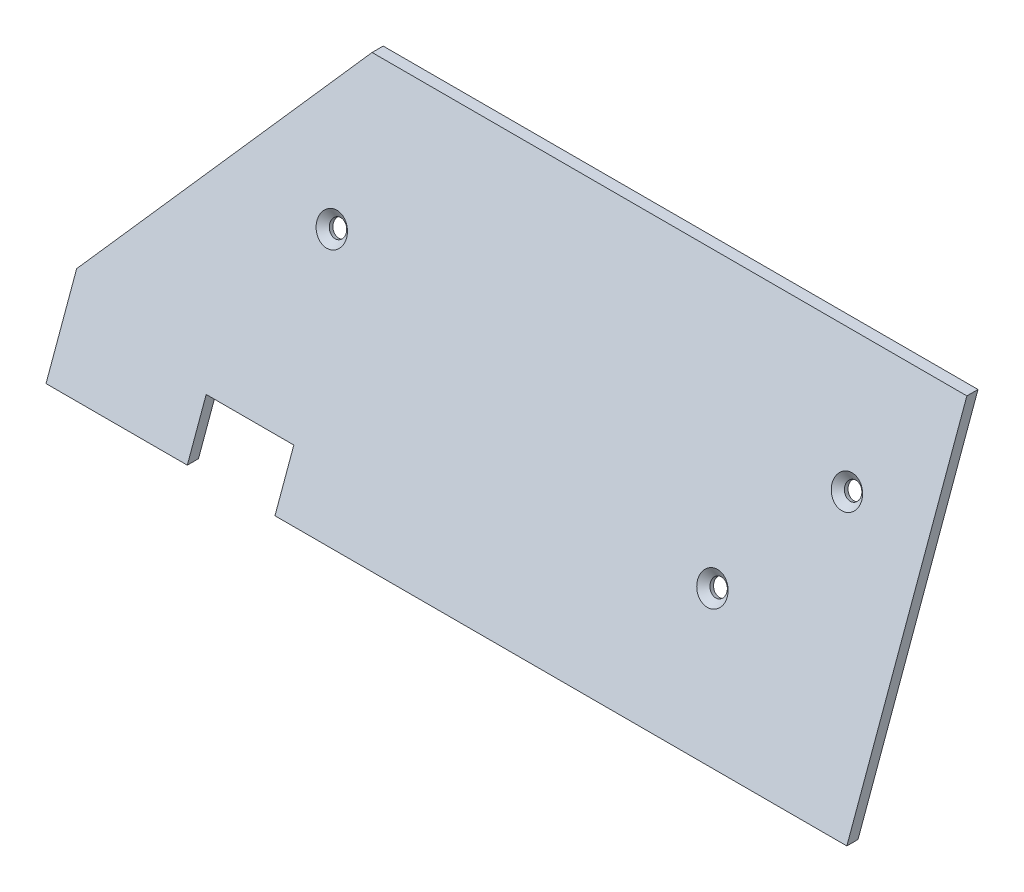
ISO-10303-21;
HEADER;
FILE_DESCRIPTION(('STEP AP214'),'2;1');
FILE_NAME('part.step','',(''),(''),'','','');
FILE_SCHEMA(('AUTOMOTIVE_DESIGN { 1 0 10303 214 1 1 1 1 }'));
ENDSEC;
DATA;
#1=APPLICATION_CONTEXT('core data for automotive mechanical design processes');
#2=APPLICATION_PROTOCOL_DEFINITION('international standard','automotive_design',2000,#1);
#3=PRODUCT_CONTEXT('',#1,'mechanical');
#4=PRODUCT('Part','Part','',(#3));
#5=PRODUCT_RELATED_PRODUCT_CATEGORY('part','',(#4));
#6=PRODUCT_DEFINITION_FORMATION('','',#4);
#7=PRODUCT_DEFINITION_CONTEXT('part definition',#1,'design');
#8=PRODUCT_DEFINITION('design','',#6,#7);
#9=PRODUCT_DEFINITION_SHAPE('','',#8);
#10=(LENGTH_UNIT() NAMED_UNIT(*) SI_UNIT(.MILLI.,.METRE.));
#11=(NAMED_UNIT(*) PLANE_ANGLE_UNIT() SI_UNIT($,.RADIAN.));
#12=(NAMED_UNIT(*) SI_UNIT($,.STERADIAN.) SOLID_ANGLE_UNIT());
#13=UNCERTAINTY_MEASURE_WITH_UNIT(LENGTH_MEASURE(1.E-05),#10,'distance_accuracy_value','');
#14=(GEOMETRIC_REPRESENTATION_CONTEXT(3) GLOBAL_UNCERTAINTY_ASSIGNED_CONTEXT((#13)) GLOBAL_UNIT_ASSIGNED_CONTEXT((#10,
#11,#12)) REPRESENTATION_CONTEXT('',''));
#15=CARTESIAN_POINT('',(0.,0.,0.));
#16=DIRECTION('',(0.,0.,1.));
#17=DIRECTION('',(1.,0.,0.));
#18=AXIS2_PLACEMENT_3D('',#15,#16,#17);
#19=CARTESIAN_POINT('',(85.,0.,0.));
#20=DIRECTION('',(0.,1.,0.));
#21=DIRECTION('',(0.,0.,1.));
#22=AXIS2_PLACEMENT_3D('',#19,#20,#21);
#23=PLANE('',#22);
#24=DIRECTION('',(0.,0.,-1.));
#25=VECTOR('',#24,1.);
#26=CARTESIAN_POINT('',(-55.,0.,0.));
#27=LINE('',#26,#25);
#28=CARTESIAN_POINT('',(-55.,0.,2.36220000000002));
#29=VERTEX_POINT('',#28);
#30=CARTESIAN_POINT('',(-55.,0.,0.));
#31=VERTEX_POINT('',#30);
#32=EDGE_CURVE('E49',#29,#31,#27,.T.);
#33=ORIENTED_EDGE('',*,*,#32,.F.);
#34=DIRECTION('',(-1.,0.,0.));
#35=VECTOR('',#34,1.);
#36=CARTESIAN_POINT('',(85.,0.,2.36220000000002));
#37=LINE('',#36,#35);
#38=CARTESIAN_POINT('',(-85.,0.,2.36220000000002));
#39=VERTEX_POINT('',#38);
#40=EDGE_CURVE('E191',#29,#39,#37,.T.);
#41=ORIENTED_EDGE('',*,*,#40,.T.);
#42=DIRECTION('',(0.,0.,-1.));
#43=VECTOR('',#42,1.);
#44=CARTESIAN_POINT('',(-85.,0.,0.));
#45=LINE('',#44,#43);
#46=CARTESIAN_POINT('',(-85.,0.,0.));
#47=VERTEX_POINT('',#46);
#48=EDGE_CURVE('E173',#39,#47,#45,.T.);
#49=ORIENTED_EDGE('',*,*,#48,.T.);
#50=DIRECTION('',(-1.,0.,0.));
#51=VECTOR('',#50,1.);
#52=CARTESIAN_POINT('',(85.,0.,0.));
#53=LINE('',#52,#51);
#54=EDGE_CURVE('E179',#31,#47,#53,.T.);
#55=ORIENTED_EDGE('',*,*,#54,.F.);
#56=EDGE_LOOP('',(#33,#41,#49,#55));
#57=FACE_BOUND('',#56,.T.);
#58=ADVANCED_FACE('F41',(#57),#23,.F.);
#59=CARTESIAN_POINT('',(85.,70.,-25.4779163986345));
#60=DIRECTION('',(0.,0.342020143325672,0.939692620785907));
#61=DIRECTION('',(0.,-0.939692620785907,0.342020143325672));
#62=AXIS2_PLACEMENT_3D('',#59,#60,#61);
#63=PLANE('',#62);
#64=CARTESIAN_POINT('',(-39.9999999999988,42.2867083830977,-15.3911031565429));
#65=DIRECTION('',(0.,0.342020143325672,0.939692620785907));
#66=DIRECTION('',(0.,-0.939692620785907,0.342020143325672));
#67=AXIS2_PLACEMENT_3D('',#64,#65,#66);
#68=CIRCLE('',#67,1.74999999999999);
#69=CARTESIAN_POINT('',(-39.9999999999988,40.6422462967224,-14.7925679057229));
#70=VERTEX_POINT('',#69);
#71=EDGE_CURVE('E147',#70,#70,#68,.T.);
#72=ORIENTED_EDGE('',*,*,#71,.T.);
#73=EDGE_LOOP('',(#72));
#74=FACE_BOUND('',#73,.T.);
#75=CARTESIAN_POINT('',(67.6378,46.9865856163311,-17.1017185741452));
#76=DIRECTION('',(0.,0.342020143325672,0.939692620785907));
#77=DIRECTION('',(0.,-0.939692620785907,0.342020143325672));
#78=AXIS2_PLACEMENT_3D('',#75,#76,#77);
#79=CIRCLE('',#78,1.75);
#80=CARTESIAN_POINT('',(67.6378,45.3421235299558,-16.5031833233253));
#81=VERTEX_POINT('',#80);
#82=EDGE_CURVE('E161',#81,#81,#79,.T.);
#83=ORIENTED_EDGE('',*,*,#82,.T.);
#84=EDGE_LOOP('',(#83));
#85=FACE_BOUND('',#84,.T.);
#86=CARTESIAN_POINT('',(47.6378,23.4942700966835,-8.55121499100342));
#87=DIRECTION('',(0.,0.342020143325672,0.939692620785907));
#88=DIRECTION('',(0.,-0.939692620785907,0.342020143325672));
#89=AXIS2_PLACEMENT_3D('',#86,#87,#88);
#90=CIRCLE('',#89,1.75);
#91=CARTESIAN_POINT('',(47.6378,21.8498080103081,-7.95267974018349));
#92=VERTEX_POINT('',#91);
#93=EDGE_CURVE('E168',#92,#92,#90,.T.);
#94=ORIENTED_EDGE('',*,*,#93,.T.);
#95=EDGE_LOOP('',(#94));
#96=FACE_BOUND('',#95,.T.);
#97=CARTESIAN_POINT('',(85.,0.,0.));
#98=VERTEX_POINT('',#97);
#99=CARTESIAN_POINT('',(-36.3999999999999,0.,0.));
#100=VERTEX_POINT('',#99);
#101=EDGE_CURVE('E188',#98,#100,#53,.T.);
#102=ORIENTED_EDGE('',*,*,#101,.T.);
#103=DIRECTION('',(0.,0.939692620785907,-0.342020143325672));
#104=VECTOR('',#103,1.);
#105=CARTESIAN_POINT('',(-36.4,70.,-25.4779163986345));
#106=LINE('',#105,#104);
#107=CARTESIAN_POINT('',(-36.4,11.0019545770355,-4.00438398478977));
#108=VERTEX_POINT('',#107);
#109=EDGE_CURVE('E138',#100,#108,#106,.T.);
#110=ORIENTED_EDGE('',*,*,#109,.T.);
#111=DIRECTION('',(1.,0.,0.));
#112=VECTOR('',#111,1.);
#113=CARTESIAN_POINT('',(85.,11.0019545770356,-4.00438398478981));
#114=LINE('',#113,#112);
#115=CARTESIAN_POINT('',(-55.,11.0019545770355,-4.00438398478977));
#116=VERTEX_POINT('',#115);
#117=EDGE_CURVE('E128',#116,#108,#114,.T.);
#118=ORIENTED_EDGE('',*,*,#117,.F.);
#119=DIRECTION('',(0.,0.939692620785907,-0.342020143325672));
#120=VECTOR('',#119,1.);
#121=CARTESIAN_POINT('',(-55.,70.,-25.4779163986345));
#122=LINE('',#121,#120);
#123=EDGE_CURVE('E136',#31,#116,#122,.T.);
#124=ORIENTED_EDGE('',*,*,#123,.F.);
#125=ORIENTED_EDGE('',*,*,#54,.T.);
#126=DIRECTION('',(0.,0.939692620785907,-0.342020143325672));
#127=VECTOR('',#126,1.);
#128=CARTESIAN_POINT('',(-85.,70.,-25.4779163986345));
#129=LINE('',#128,#127);
#130=CARTESIAN_POINT('',(-85.,17.8763038889129,-6.50644251426154));
#131=VERTEX_POINT('',#130);
#132=EDGE_CURVE('E180',#47,#131,#129,.T.);
#133=ORIENTED_EDGE('',*,*,#132,.T.);
#134=DIRECTION('',(0.619171091480102,0.737899372701881,-0.268573407547191));
#135=VECTOR('',#134,1.);
#136=CARTESIAN_POINT('',(7.14278904333822,127.68780376296,-46.4745598485421));
#137=LINE('',#136,#135);
#138=CARTESIAN_POINT('',(-41.2630258175897,70.,-25.4779163986345));
#139=VERTEX_POINT('',#138);
#140=EDGE_CURVE('E64',#131,#139,#137,.T.);
#141=ORIENTED_EDGE('',*,*,#140,.T.);
#142=DIRECTION('',(-1.,0.,0.));
#143=VECTOR('',#142,1.);
#144=CARTESIAN_POINT('',(85.,70.,-25.4779163986345));
#145=LINE('',#144,#143);
#146=CARTESIAN_POINT('',(85.,70.,-25.4779163986345));
#147=VERTEX_POINT('',#146);
#148=EDGE_CURVE('E197',#147,#139,#145,.T.);
#149=ORIENTED_EDGE('',*,*,#148,.F.);
#150=DIRECTION('',(0.,0.939692620785907,-0.342020143325672));
#151=VECTOR('',#150,1.);
#152=CARTESIAN_POINT('',(85.,70.,-25.4779163986345));
#153=LINE('',#152,#151);
#154=EDGE_CURVE('E169',#98,#147,#153,.T.);
#155=ORIENTED_EDGE('',*,*,#154,.F.);
#156=EDGE_LOOP('',(#102,#110,#118,#124,#125,#133,#141,#149,#155));
#157=FACE_BOUND('',#156,.T.);
#158=ADVANCED_FACE('F43',(#74,#85,#96,#157),#63,.F.);
#159=CARTESIAN_POINT('',(85.,70.,-23.1157163986345));
#160=DIRECTION('',(0.,-1.,0.));
#161=DIRECTION('',(0.,0.,-1.));
#162=AXIS2_PLACEMENT_3D('',#159,#160,#161);
#163=PLANE('',#162);
#164=ORIENTED_EDGE('',*,*,#148,.T.);
#165=DIRECTION('',(0.,0.,1.));
#166=VECTOR('',#165,1.);
#167=CARTESIAN_POINT('',(-41.2630258175897,70.,-28.5999999999999));
#168=LINE('',#167,#166);
#169=CARTESIAN_POINT('',(-41.2630258175897,70.,-23.1157163986345));
#170=VERTEX_POINT('',#169);
#171=EDGE_CURVE('E148',#139,#170,#168,.T.);
#172=ORIENTED_EDGE('',*,*,#171,.T.);
#173=DIRECTION('',(-1.,0.,0.));
#174=VECTOR('',#173,1.);
#175=CARTESIAN_POINT('',(85.,70.,-23.1157163986345));
#176=LINE('',#175,#174);
#177=CARTESIAN_POINT('',(85.,70.,-23.1157163986345));
#178=VERTEX_POINT('',#177);
#179=EDGE_CURVE('E194',#178,#170,#176,.T.);
#180=ORIENTED_EDGE('',*,*,#179,.F.);
#181=DIRECTION('',(0.,0.,1.));
#182=VECTOR('',#181,1.);
#183=CARTESIAN_POINT('',(85.,70.,-23.1157163986345));
#184=LINE('',#183,#182);
#185=EDGE_CURVE('E172',#147,#178,#184,.T.);
#186=ORIENTED_EDGE('',*,*,#185,.F.);
#187=EDGE_LOOP('',(#164,#172,#180,#186));
#188=FACE_BOUND('',#187,.T.);
#189=ADVANCED_FACE('F220',(#188),#163,.F.);
#190=CARTESIAN_POINT('',(85.,0.,2.36220000000002));
#191=DIRECTION('',(0.,-0.342020143325672,-0.939692620785907));
#192=DIRECTION('',(0.,0.939692620785907,-0.342020143325672));
#193=AXIS2_PLACEMENT_3D('',#190,#191,#192);
#194=PLANE('',#193);
#195=CARTESIAN_POINT('',(-39.9999999999988,43.0459048288985,-13.305228064775));
#196=DIRECTION('',(0.,0.342020143325673,0.939692620785907));
#197=DIRECTION('',(0.,-0.939692620785907,0.342020143325673));
#198=AXIS2_PLACEMENT_3D('',#195,#196,#197);
#199=CIRCLE('',#198,3.15);
#200=CARTESIAN_POINT('',(-39.9999999999988,40.0858730734229,-12.2278646132992));
#201=VERTEX_POINT('',#200);
#202=EDGE_CURVE('E141',#201,#201,#199,.T.);
#203=ORIENTED_EDGE('',*,*,#202,.F.);
#204=EDGE_LOOP('',(#203));
#205=FACE_BOUND('',#204,.T.);
#206=CARTESIAN_POINT('',(67.6378,47.7457820621319,-15.0158434823774));
#207=DIRECTION('',(0.,0.342020143325672,0.939692620785907));
#208=DIRECTION('',(0.,-0.939692620785907,0.342020143325672));
#209=AXIS2_PLACEMENT_3D('',#206,#207,#208);
#210=CIRCLE('',#209,3.15);
#211=CARTESIAN_POINT('',(67.6378,44.7857503066563,-13.9384800309015));
#212=VERTEX_POINT('',#211);
#213=EDGE_CURVE('E155',#212,#212,#210,.T.);
#214=ORIENTED_EDGE('',*,*,#213,.F.);
#215=EDGE_LOOP('',(#214));
#216=FACE_BOUND('',#215,.T.);
#217=CARTESIAN_POINT('',(47.6378,24.2534665424843,-6.46533989923559));
#218=DIRECTION('',(0.,0.342020143325672,0.939692620785907));
#219=DIRECTION('',(0.,-0.939692620785907,0.342020143325672));
#220=AXIS2_PLACEMENT_3D('',#217,#218,#219);
#221=CIRCLE('',#220,3.15);
#222=CARTESIAN_POINT('',(47.6378,21.2934347870087,-5.38797644775972));
#223=VERTEX_POINT('',#222);
#224=EDGE_CURVE('E162',#223,#223,#221,.T.);
#225=ORIENTED_EDGE('',*,*,#224,.F.);
#226=EDGE_LOOP('',(#225));
#227=FACE_BOUND('',#226,.T.);
#228=DIRECTION('',(1.,0.,0.));
#229=VECTOR('',#228,1.);
#230=CARTESIAN_POINT('',(0.,11.0019545770355,-1.64218398478977));
#231=LINE('',#230,#229);
#232=CARTESIAN_POINT('',(-55.,11.0019545770355,-1.64218398478975));
#233=VERTEX_POINT('',#232);
#234=CARTESIAN_POINT('',(-36.4,11.0019545770355,-1.64218398478976));
#235=VERTEX_POINT('',#234);
#236=EDGE_CURVE('E122',#233,#235,#231,.T.);
#237=ORIENTED_EDGE('',*,*,#236,.T.);
#238=DIRECTION('',(0.,0.939692620785907,-0.342020143325672));
#239=VECTOR('',#238,1.);
#240=CARTESIAN_POINT('',(-36.3999999999999,-6.75722963681457,4.82163045390196));
#241=LINE('',#240,#239);
#242=CARTESIAN_POINT('',(-36.3999999999999,0.,2.36220000000001));
#243=VERTEX_POINT('',#242);
#244=EDGE_CURVE('E113',#243,#235,#241,.T.);
#245=ORIENTED_EDGE('',*,*,#244,.F.);
#246=CARTESIAN_POINT('',(85.,0.,2.36220000000002));
#247=VERTEX_POINT('',#246);
#248=EDGE_CURVE('E192',#247,#243,#37,.T.);
#249=ORIENTED_EDGE('',*,*,#248,.F.);
#250=DIRECTION('',(0.,-0.939692620785907,0.342020143325672));
#251=VECTOR('',#250,1.);
#252=CARTESIAN_POINT('',(85.,0.,2.36220000000002));
#253=LINE('',#252,#251);
#254=EDGE_CURVE('E175',#178,#247,#253,.T.);
#255=ORIENTED_EDGE('',*,*,#254,.F.);
#256=ORIENTED_EDGE('',*,*,#179,.T.);
#257=DIRECTION('',(-0.619171091480102,-0.737899372701881,0.268573407547191));
#258=VECTOR('',#257,1.);
#259=CARTESIAN_POINT('',(-29.0760245029378,84.5239025996867,-28.401984630302));
#260=LINE('',#259,#258);
#261=CARTESIAN_POINT('',(-85.,17.8763038889129,-4.14424251426153));
#262=VERTEX_POINT('',#261);
#263=EDGE_CURVE('E151',#170,#262,#260,.T.);
#264=ORIENTED_EDGE('',*,*,#263,.T.);
#265=DIRECTION('',(0.,-0.939692620785907,0.342020143325672));
#266=VECTOR('',#265,1.);
#267=CARTESIAN_POINT('',(-85.,0.,2.36220000000002));
#268=LINE('',#267,#266);
#269=EDGE_CURVE('E183',#262,#39,#268,.T.);
#270=ORIENTED_EDGE('',*,*,#269,.T.);
#271=ORIENTED_EDGE('',*,*,#40,.F.);
#272=DIRECTION('',(0.,0.939692620785907,-0.342020143325672));
#273=VECTOR('',#272,1.);
#274=CARTESIAN_POINT('',(-54.9999999999999,-6.75722963681458,4.82163045390197));
#275=LINE('',#274,#273);
#276=EDGE_CURVE('E56',#29,#233,#275,.T.);
#277=ORIENTED_EDGE('',*,*,#276,.T.);
#278=EDGE_LOOP('',(#237,#245,#249,#255,#256,#264,#270,#271,#277));
#279=FACE_BOUND('',#278,.T.);
#280=ADVANCED_FACE('F131',(#205,#216,#227,#279),#194,.F.);
#281=ORIENTED_EDGE('',*,*,#248,.T.);
#282=DIRECTION('',(0.,0.,-1.));
#283=VECTOR('',#282,1.);
#284=CARTESIAN_POINT('',(-36.3999999999999,0.,0.));
#285=LINE('',#284,#283);
#286=EDGE_CURVE('E11',#243,#100,#285,.T.);
#287=ORIENTED_EDGE('',*,*,#286,.T.);
#288=ORIENTED_EDGE('',*,*,#101,.F.);
#289=DIRECTION('',(0.,0.,-1.));
#290=VECTOR('',#289,1.);
#291=CARTESIAN_POINT('',(85.,0.,0.));
#292=LINE('',#291,#290);
#293=EDGE_CURVE('E177',#247,#98,#292,.T.);
#294=ORIENTED_EDGE('',*,*,#293,.F.);
#295=EDGE_LOOP('',(#281,#287,#288,#294));
#296=FACE_BOUND('',#295,.T.);
#297=ADVANCED_FACE('F228',(#296),#23,.F.);
#298=CARTESIAN_POINT('',(85.,0.,0.));
#299=DIRECTION('',(-1.,0.,0.));
#300=DIRECTION('',(0.,0.,1.));
#301=AXIS2_PLACEMENT_3D('',#298,#299,#300);
#302=PLANE('',#301);
#303=ORIENTED_EDGE('',*,*,#154,.T.);
#304=ORIENTED_EDGE('',*,*,#185,.T.);
#305=ORIENTED_EDGE('',*,*,#254,.T.);
#306=ORIENTED_EDGE('',*,*,#293,.T.);
#307=EDGE_LOOP('',(#303,#304,#305,#306));
#308=FACE_BOUND('',#307,.T.);
#309=ADVANCED_FACE('F224',(#308),#302,.F.);
#310=CARTESIAN_POINT('',(-85.,0.,0.));
#311=DIRECTION('',(-1.,0.,0.));
#312=DIRECTION('',(0.,0.,1.));
#313=AXIS2_PLACEMENT_3D('',#310,#311,#312);
#314=PLANE('',#313);
#315=DIRECTION('',(0.,0.,1.));
#316=VECTOR('',#315,1.);
#317=CARTESIAN_POINT('',(-85.,17.8763038889129,0.));
#318=LINE('',#317,#316);
#319=EDGE_CURVE('E200',#131,#262,#318,.T.);
#320=ORIENTED_EDGE('',*,*,#319,.F.);
#321=ORIENTED_EDGE('',*,*,#132,.F.);
#322=ORIENTED_EDGE('',*,*,#48,.F.);
#323=ORIENTED_EDGE('',*,*,#269,.F.);
#324=EDGE_LOOP('',(#320,#321,#322,#323));
#325=FACE_BOUND('',#324,.T.);
#326=ADVANCED_FACE('F216',(#325),#314,.T.);
#327=CARTESIAN_POINT('',(47.6378,24.2534665424843,-6.46533989923559));
#328=DIRECTION('',(0.,0.342020143325672,0.939692620785907));
#329=DIRECTION('',(0.,-0.939692620785907,0.342020143325672));
#330=AXIS2_PLACEMENT_3D('',#327,#328,#329);
#331=CYLINDRICAL_SURFACE('',#330,1.75);
#332=CARTESIAN_POINT('',(47.6378,23.7746383418283,-7.78090956833586));
#333=DIRECTION('',(0.,0.342020143325672,0.939692620785907));
#334=DIRECTION('',(0.,-0.939692620785907,0.342020143325672));
#335=AXIS2_PLACEMENT_3D('',#332,#333,#334);
#336=CIRCLE('',#335,1.75);
#337=CARTESIAN_POINT('',(47.6378,22.130176255453,-7.18237431751593));
#338=VERTEX_POINT('',#337);
#339=EDGE_CURVE('E165',#338,#338,#336,.T.);
#340=ORIENTED_EDGE('',*,*,#339,.T.);
#341=EDGE_LOOP('',(#340));
#342=FACE_BOUND('',#341,.T.);
#343=ORIENTED_EDGE('',*,*,#93,.F.);
#344=EDGE_LOOP('',(#343));
#345=FACE_BOUND('',#344,.T.);
#346=ADVANCED_FACE('F270',(#342,#345),#331,.F.);
#347=CARTESIAN_POINT('',(47.6378,24.2534665424843,-6.46533989923559));
#348=DIRECTION('',(0.,0.342020143325672,0.939692620785907));
#349=DIRECTION('',(0.,-0.939692620785907,0.342020143325672));
#350=AXIS2_PLACEMENT_3D('',#347,#348,#349);
#351=CONICAL_SURFACE('',#350,3.15,0.785398163397448);
#352=ORIENTED_EDGE('',*,*,#339,.F.);
#353=EDGE_LOOP('',(#352));
#354=FACE_BOUND('',#353,.T.);
#355=ORIENTED_EDGE('',*,*,#224,.T.);
#356=EDGE_LOOP('',(#355));
#357=FACE_BOUND('',#356,.T.);
#358=ADVANCED_FACE('F268',(#354,#357),#351,.F.);
#359=CARTESIAN_POINT('',(67.6378,47.7457820621319,-15.0158434823774));
#360=DIRECTION('',(0.,0.342020143325672,0.939692620785907));
#361=DIRECTION('',(0.,-0.939692620785907,0.342020143325672));
#362=AXIS2_PLACEMENT_3D('',#359,#360,#361);
#363=CYLINDRICAL_SURFACE('',#362,1.75);
#364=CARTESIAN_POINT('',(67.6378,47.266953861476,-16.3314131514777));
#365=DIRECTION('',(0.,0.342020143325672,0.939692620785907));
#366=DIRECTION('',(0.,-0.939692620785907,0.342020143325672));
#367=AXIS2_PLACEMENT_3D('',#364,#365,#366);
#368=CIRCLE('',#367,1.75);
#369=CARTESIAN_POINT('',(67.6378,45.6224917751006,-15.7328779006577));
#370=VERTEX_POINT('',#369);
#371=EDGE_CURVE('E158',#370,#370,#368,.T.);
#372=ORIENTED_EDGE('',*,*,#371,.T.);
#373=EDGE_LOOP('',(#372));
#374=FACE_BOUND('',#373,.T.);
#375=ORIENTED_EDGE('',*,*,#82,.F.);
#376=EDGE_LOOP('',(#375));
#377=FACE_BOUND('',#376,.T.);
#378=ADVANCED_FACE('F241',(#374,#377),#363,.F.);
#379=CARTESIAN_POINT('',(67.6378,47.7457820621319,-15.0158434823774));
#380=DIRECTION('',(0.,0.342020143325672,0.939692620785907));
#381=DIRECTION('',(0.,-0.939692620785907,0.342020143325672));
#382=AXIS2_PLACEMENT_3D('',#379,#380,#381);
#383=CONICAL_SURFACE('',#382,3.15,0.785398163397447);
#384=ORIENTED_EDGE('',*,*,#371,.F.);
#385=EDGE_LOOP('',(#384));
#386=FACE_BOUND('',#385,.T.);
#387=ORIENTED_EDGE('',*,*,#213,.T.);
#388=EDGE_LOOP('',(#387));
#389=FACE_BOUND('',#388,.T.);
#390=ADVANCED_FACE('F232',(#386,#389),#383,.F.);
#391=CARTESIAN_POINT('',(-58.682408883346,49.2403876506105,-28.5999999999999));
#392=DIRECTION('',(0.766044443118974,-0.642787609686544,0.));
#393=DIRECTION('',(0.642787609686544,0.766044443118975,0.));
#394=AXIS2_PLACEMENT_3D('',#391,#392,#393);
#395=PLANE('',#394);
#396=ORIENTED_EDGE('',*,*,#319,.T.);
#397=ORIENTED_EDGE('',*,*,#263,.F.);
#398=ORIENTED_EDGE('',*,*,#171,.F.);
#399=ORIENTED_EDGE('',*,*,#140,.F.);
#400=EDGE_LOOP('',(#396,#397,#398,#399));
#401=FACE_BOUND('',#400,.T.);
#402=ADVANCED_FACE('F229',(#401),#395,.F.);
#403=CARTESIAN_POINT('',(-39.9999999999988,43.0459048288985,-13.305228064775));
#404=DIRECTION('',(0.,0.342020143325673,0.939692620785907));
#405=DIRECTION('',(0.,-0.939692620785907,0.342020143325673));
#406=AXIS2_PLACEMENT_3D('',#403,#404,#405);
#407=CYLINDRICAL_SURFACE('',#406,1.74999999999999);
#408=CARTESIAN_POINT('',(-39.9999999999988,42.5670766282426,-14.6207977338753));
#409=DIRECTION('',(0.,0.342020143325673,0.939692620785907));
#410=DIRECTION('',(0.,-0.939692620785907,0.342020143325673));
#411=AXIS2_PLACEMENT_3D('',#408,#409,#410);
#412=CIRCLE('',#411,1.74999999999999);
#413=CARTESIAN_POINT('',(-39.9999999999988,40.9226145418673,-14.0222624830554));
#414=VERTEX_POINT('',#413);
#415=EDGE_CURVE('E144',#414,#414,#412,.T.);
#416=ORIENTED_EDGE('',*,*,#415,.T.);
#417=EDGE_LOOP('',(#416));
#418=FACE_BOUND('',#417,.T.);
#419=ORIENTED_EDGE('',*,*,#71,.F.);
#420=EDGE_LOOP('',(#419));
#421=FACE_BOUND('',#420,.T.);
#422=ADVANCED_FACE('F231',(#418,#421),#407,.F.);
#423=CARTESIAN_POINT('',(-39.9999999999988,43.0459048288985,-13.305228064775));
#424=DIRECTION('',(0.,0.342020143325673,0.939692620785907));
#425=DIRECTION('',(0.,-0.939692620785907,0.342020143325673));
#426=AXIS2_PLACEMENT_3D('',#423,#424,#425);
#427=CONICAL_SURFACE('',#426,3.15,0.785398163397452);
#428=ORIENTED_EDGE('',*,*,#415,.F.);
#429=EDGE_LOOP('',(#428));
#430=FACE_BOUND('',#429,.T.);
#431=ORIENTED_EDGE('',*,*,#202,.T.);
#432=EDGE_LOOP('',(#431));
#433=FACE_BOUND('',#432,.T.);
#434=ADVANCED_FACE('F238',(#430,#433),#427,.F.);
#435=CARTESIAN_POINT('',(0.,11.0019545770354,23.3869662991191));
#436=DIRECTION('',(0.,-1.,0.));
#437=DIRECTION('',(0.,0.,-1.));
#438=AXIS2_PLACEMENT_3D('',#435,#436,#437);
#439=PLANE('',#438);
#440=ORIENTED_EDGE('',*,*,#117,.T.);
#441=DIRECTION('',(0.,0.,-1.));
#442=VECTOR('',#441,1.);
#443=CARTESIAN_POINT('',(-36.3999999999999,11.0019545770354,23.3869662991191));
#444=LINE('',#443,#442);
#445=EDGE_CURVE('E116',#235,#108,#444,.T.);
#446=ORIENTED_EDGE('',*,*,#445,.F.);
#447=ORIENTED_EDGE('',*,*,#236,.F.);
#448=DIRECTION('',(0.,0.,-1.));
#449=VECTOR('',#448,1.);
#450=CARTESIAN_POINT('',(-54.9999999999999,11.0019545770354,23.3869662991192));
#451=LINE('',#450,#449);
#452=EDGE_CURVE('E129',#233,#116,#451,.T.);
#453=ORIENTED_EDGE('',*,*,#452,.T.);
#454=EDGE_LOOP('',(#440,#446,#447,#453));
#455=FACE_BOUND('',#454,.T.);
#456=ADVANCED_FACE('F125',(#455),#439,.T.);
#457=CARTESIAN_POINT('',(-36.3999999999999,0.,23.3869662991191));
#458=DIRECTION('',(1.,0.,0.));
#459=DIRECTION('',(0.,0.,-1.));
#460=AXIS2_PLACEMENT_3D('',#457,#458,#459);
#461=PLANE('',#460);
#462=ORIENTED_EDGE('',*,*,#286,.F.);
#463=ORIENTED_EDGE('',*,*,#244,.T.);
#464=ORIENTED_EDGE('',*,*,#445,.T.);
#465=ORIENTED_EDGE('',*,*,#109,.F.);
#466=EDGE_LOOP('',(#462,#463,#464,#465));
#467=FACE_BOUND('',#466,.T.);
#468=ADVANCED_FACE('F115',(#467),#461,.F.);
#469=CARTESIAN_POINT('',(-54.9999999999999,0.,23.3869662991191));
#470=DIRECTION('',(1.,0.,0.));
#471=DIRECTION('',(0.,0.,-1.));
#472=AXIS2_PLACEMENT_3D('',#469,#470,#471);
#473=PLANE('',#472);
#474=ORIENTED_EDGE('',*,*,#123,.T.);
#475=ORIENTED_EDGE('',*,*,#452,.F.);
#476=ORIENTED_EDGE('',*,*,#276,.F.);
#477=ORIENTED_EDGE('',*,*,#32,.T.);
#478=EDGE_LOOP('',(#474,#475,#476,#477));
#479=FACE_BOUND('',#478,.T.);
#480=ADVANCED_FACE('F208',(#479),#473,.T.);
#481=CLOSED_SHELL('',(#58,#158,#189,#280,#297,#309,#326,#346,#358,#378,#390,#402,#422,#434,#456,
#468,#480));
#482=MANIFOLD_SOLID_BREP('B2',#481);
#483=ADVANCED_BREP_SHAPE_REPRESENTATION('',(#18,#482),#14);
#484=SHAPE_DEFINITION_REPRESENTATION(#9,#483);
ENDSEC;
END-ISO-10303-21;
